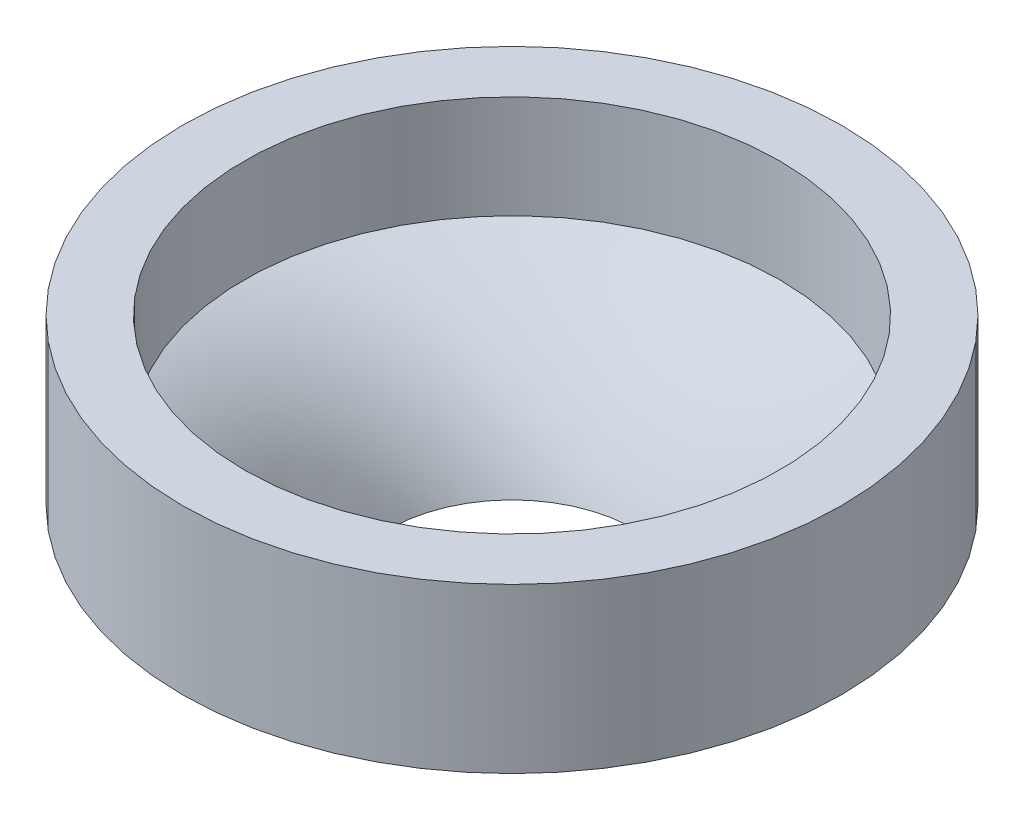
ISO-10303-21;
HEADER;
FILE_DESCRIPTION(('STEP AP214'),'2;1');
FILE_NAME('part.step','',(''),(''),'','','');
FILE_SCHEMA(('AUTOMOTIVE_DESIGN { 1 0 10303 214 1 1 1 1 }'));
ENDSEC;
DATA;
#1=APPLICATION_CONTEXT('core data for automotive mechanical design processes');
#2=APPLICATION_PROTOCOL_DEFINITION('international standard','automotive_design',2000,#1);
#3=PRODUCT_CONTEXT('',#1,'mechanical');
#4=PRODUCT('Part','Part','',(#3));
#5=PRODUCT_RELATED_PRODUCT_CATEGORY('part','',(#4));
#6=PRODUCT_DEFINITION_FORMATION('','',#4);
#7=PRODUCT_DEFINITION_CONTEXT('part definition',#1,'design');
#8=PRODUCT_DEFINITION('design','',#6,#7);
#9=PRODUCT_DEFINITION_SHAPE('','',#8);
#10=(LENGTH_UNIT() NAMED_UNIT(*) SI_UNIT(.MILLI.,.METRE.));
#11=(NAMED_UNIT(*) PLANE_ANGLE_UNIT() SI_UNIT($,.RADIAN.));
#12=(NAMED_UNIT(*) SI_UNIT($,.STERADIAN.) SOLID_ANGLE_UNIT());
#13=UNCERTAINTY_MEASURE_WITH_UNIT(LENGTH_MEASURE(1.E-05),#10,'distance_accuracy_value','');
#14=(GEOMETRIC_REPRESENTATION_CONTEXT(3) GLOBAL_UNCERTAINTY_ASSIGNED_CONTEXT((#13)) GLOBAL_UNIT_ASSIGNED_CONTEXT((#10,
#11,#12)) REPRESENTATION_CONTEXT('',''));
#15=CARTESIAN_POINT('',(0.,0.,0.));
#16=DIRECTION('',(0.,0.,1.));
#17=DIRECTION('',(1.,0.,0.));
#18=AXIS2_PLACEMENT_3D('',#15,#16,#17);
#19=CARTESIAN_POINT('',(0.,-46.0691867925587,63.0564364751651));
#20=DIRECTION('',(0.,1.,0.));
#21=DIRECTION('',(0.,0.,1.));
#22=AXIS2_PLACEMENT_3D('',#19,#20,#21);
#23=TOROIDAL_SURFACE('',#22,14.7632627466868,5.93889643531693);
#24=CARTESIAN_POINT('',(0.,-44.3059240458719,63.0564364751651));
#25=DIRECTION('',(0.,1.,0.));
#26=DIRECTION('',(0.,0.,1.));
#27=AXIS2_PLACEMENT_3D('',#24,#25,#26);
#28=CIRCLE('',#27,9.09216097052662);
#29=CARTESIAN_POINT('',(0.,-44.3059240458719,72.1485974456917));
#30=VERTEX_POINT('',#29);
#31=EDGE_CURVE('E56',#30,#30,#28,.T.);
#32=ORIENTED_EDGE('',*,*,#31,.T.);
#33=EDGE_LOOP('',(#32));
#34=FACE_BOUND('',#33,.T.);
#35=CARTESIAN_POINT('',(0.,-40.2604888458853,63.0564364751651));
#36=DIRECTION('',(0.,1.,0.));
#37=DIRECTION('',(0.,0.,1.));
#38=AXIS2_PLACEMENT_3D('',#35,#36,#37);
#39=CIRCLE('',#38,16.);
#40=CARTESIAN_POINT('',(0.,-40.2604888458853,79.0564364751651));
#41=VERTEX_POINT('',#40);
#42=EDGE_CURVE('E10',#41,#41,#39,.T.);
#43=ORIENTED_EDGE('',*,*,#42,.F.);
#44=EDGE_LOOP('',(#43));
#45=FACE_BOUND('',#44,.T.);
#46=ADVANCED_FACE('F34',(#34,#45),#23,.F.);
#47=CARTESIAN_POINT('',(0.,-32.3059240458719,63.0564364751651));
#48=DIRECTION('',(0.,1.,0.));
#49=DIRECTION('',(0.,0.,1.));
#50=AXIS2_PLACEMENT_3D('',#47,#48,#49);
#51=CYLINDRICAL_SURFACE('',#50,16.);
#52=ORIENTED_EDGE('',*,*,#42,.T.);
#53=EDGE_LOOP('',(#52));
#54=FACE_BOUND('',#53,.T.);
#55=CARTESIAN_POINT('',(0.,-32.3059240458719,63.0564364751651));
#56=DIRECTION('',(0.,1.,0.));
#57=DIRECTION('',(0.,0.,1.));
#58=AXIS2_PLACEMENT_3D('',#55,#56,#57);
#59=CIRCLE('',#58,16.);
#60=CARTESIAN_POINT('',(0.,-32.3059240458719,79.0564364751651));
#61=VERTEX_POINT('',#60);
#62=EDGE_CURVE('E40',#61,#61,#59,.T.);
#63=ORIENTED_EDGE('',*,*,#62,.F.);
#64=EDGE_LOOP('',(#63));
#65=FACE_BOUND('',#64,.T.);
#66=ADVANCED_FACE('F74',(#54,#65),#51,.T.);
#67=CARTESIAN_POINT('',(0.,-32.3059240458719,79.0564364751651));
#68=DIRECTION('',(0.,1.,0.));
#69=DIRECTION('',(0.,0.,1.));
#70=AXIS2_PLACEMENT_3D('',#67,#68,#69);
#71=PLANE('',#70);
#72=ORIENTED_EDGE('',*,*,#62,.T.);
#73=EDGE_LOOP('',(#72));
#74=FACE_BOUND('',#73,.T.);
#75=CARTESIAN_POINT('',(0.,-32.3059240458719,63.0564364751651));
#76=DIRECTION('',(0.,1.,0.));
#77=DIRECTION('',(0.,0.,1.));
#78=AXIS2_PLACEMENT_3D('',#75,#76,#77);
#79=CIRCLE('',#78,13.);
#80=CARTESIAN_POINT('',(0.,-32.3059240458719,76.0564364751651));
#81=VERTEX_POINT('',#80);
#82=EDGE_CURVE('E44',#81,#81,#79,.T.);
#83=ORIENTED_EDGE('',*,*,#82,.F.);
#84=EDGE_LOOP('',(#83));
#85=FACE_BOUND('',#84,.T.);
#86=ADVANCED_FACE('F78',(#74,#85),#71,.T.);
#87=CARTESIAN_POINT('',(0.,-32.3059240458719,63.0564364751651));
#88=DIRECTION('',(0.,1.,0.));
#89=DIRECTION('',(0.,0.,1.));
#90=AXIS2_PLACEMENT_3D('',#87,#88,#89);
#91=CYLINDRICAL_SURFACE('',#90,13.);
#92=ORIENTED_EDGE('',*,*,#82,.T.);
#93=EDGE_LOOP('',(#92));
#94=FACE_BOUND('',#93,.T.);
#95=CARTESIAN_POINT('',(0.,-37.3059240458719,63.0564364751651));
#96=DIRECTION('',(0.,1.,0.));
#97=DIRECTION('',(0.,0.,1.));
#98=AXIS2_PLACEMENT_3D('',#95,#96,#97);
#99=CIRCLE('',#98,13.);
#100=CARTESIAN_POINT('',(0.,-37.3059240458719,76.0564364751651));
#101=VERTEX_POINT('',#100);
#102=EDGE_CURVE('E48',#101,#101,#99,.T.);
#103=ORIENTED_EDGE('',*,*,#102,.F.);
#104=EDGE_LOOP('',(#103));
#105=FACE_BOUND('',#104,.T.);
#106=ADVANCED_FACE('F70',(#94,#105),#91,.F.);
#107=CARTESIAN_POINT('',(0.,-49.5061172106629,63.0564364751651));
#108=DIRECTION('',(0.,1.,0.));
#109=DIRECTION('',(0.,0.,1.));
#110=AXIS2_PLACEMENT_3D('',#107,#108,#109);
#111=TOROIDAL_SURFACE('',#110,18.200193164791,13.2622291568707);
#112=ORIENTED_EDGE('',*,*,#102,.T.);
#113=EDGE_LOOP('',(#112));
#114=FACE_BOUND('',#113,.T.);
#115=CARTESIAN_POINT('',(0.,-44.3059240458719,63.0564364751651));
#116=DIRECTION('',(0.,1.,0.));
#117=DIRECTION('',(0.,0.,1.));
#118=AXIS2_PLACEMENT_3D('',#115,#116,#117);
#119=CIRCLE('',#118,5.99999999999999);
#120=CARTESIAN_POINT('',(0.,-44.3059240458719,69.0564364751651));
#121=VERTEX_POINT('',#120);
#122=EDGE_CURVE('E53',#121,#121,#119,.T.);
#123=ORIENTED_EDGE('',*,*,#122,.F.);
#124=EDGE_LOOP('',(#123));
#125=FACE_BOUND('',#124,.T.);
#126=ADVANCED_FACE('F64',(#114,#125),#111,.T.);
#127=CARTESIAN_POINT('',(0.,-44.3059240458719,69.0564364751651));
#128=DIRECTION('',(0.,-1.,0.));
#129=DIRECTION('',(0.,0.,-1.));
#130=AXIS2_PLACEMENT_3D('',#127,#128,#129);
#131=PLANE('',#130);
#132=ORIENTED_EDGE('',*,*,#122,.T.);
#133=EDGE_LOOP('',(#132));
#134=FACE_BOUND('',#133,.T.);
#135=ORIENTED_EDGE('',*,*,#31,.F.);
#136=EDGE_LOOP('',(#135));
#137=FACE_BOUND('',#136,.T.);
#138=ADVANCED_FACE('F62',(#134,#137),#131,.T.);
#139=CLOSED_SHELL('',(#46,#66,#86,#106,#126,#138));
#140=MANIFOLD_SOLID_BREP('B2',#139);
#141=ADVANCED_BREP_SHAPE_REPRESENTATION('',(#18,#140),#14);
#142=SHAPE_DEFINITION_REPRESENTATION(#9,#141);
ENDSEC;
END-ISO-10303-21;
